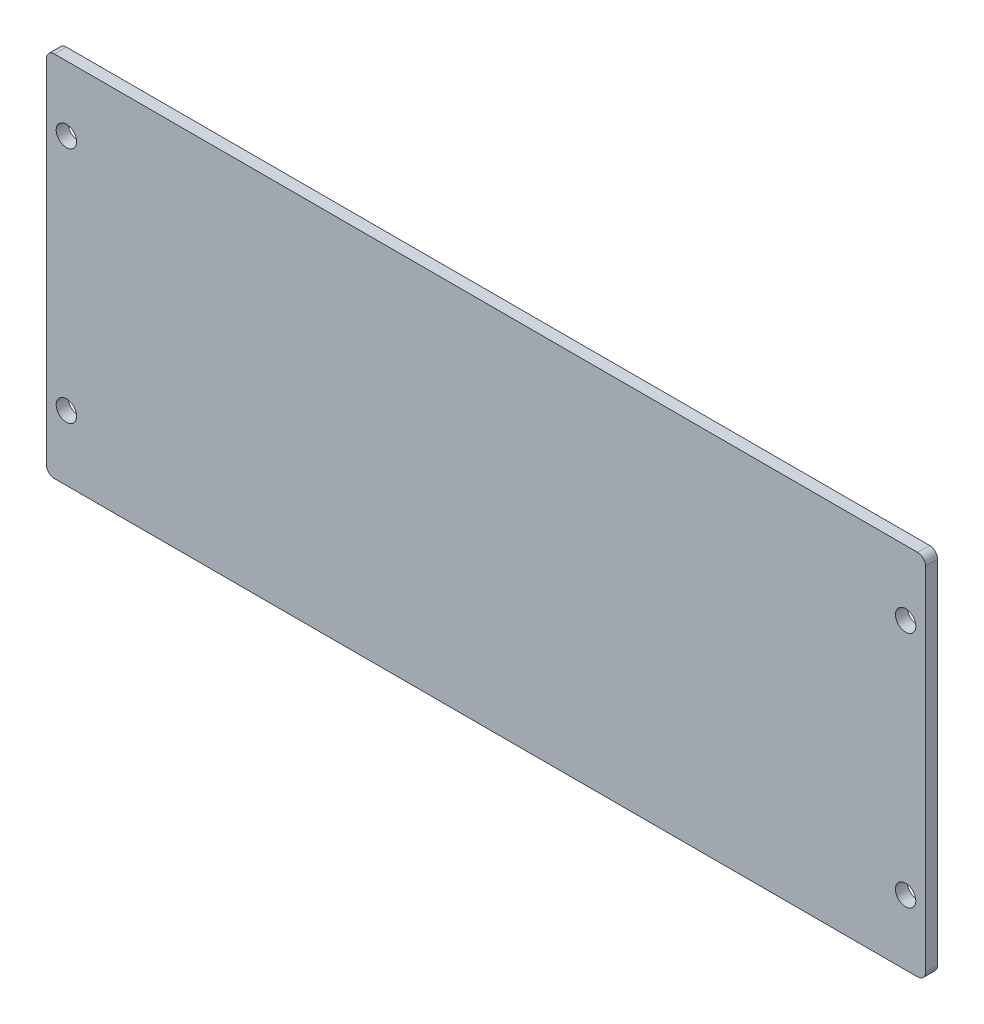
ISO-10303-21;
HEADER;
FILE_DESCRIPTION(('STEP AP214'),'2;1');
FILE_NAME('part.step','',(''),(''),'','','');
FILE_SCHEMA(('AUTOMOTIVE_DESIGN { 1 0 10303 214 1 1 1 1 }'));
ENDSEC;
DATA;
#1=APPLICATION_CONTEXT('core data for automotive mechanical design processes');
#2=APPLICATION_PROTOCOL_DEFINITION('international standard','automotive_design',2000,#1);
#3=PRODUCT_CONTEXT('',#1,'mechanical');
#4=PRODUCT('Part','Part','',(#3));
#5=PRODUCT_RELATED_PRODUCT_CATEGORY('part','',(#4));
#6=PRODUCT_DEFINITION_FORMATION('','',#4);
#7=PRODUCT_DEFINITION_CONTEXT('part definition',#1,'design');
#8=PRODUCT_DEFINITION('design','',#6,#7);
#9=PRODUCT_DEFINITION_SHAPE('','',#8);
#10=(LENGTH_UNIT() NAMED_UNIT(*) SI_UNIT(.MILLI.,.METRE.));
#11=(NAMED_UNIT(*) PLANE_ANGLE_UNIT() SI_UNIT($,.RADIAN.));
#12=(NAMED_UNIT(*) SI_UNIT($,.STERADIAN.) SOLID_ANGLE_UNIT());
#13=UNCERTAINTY_MEASURE_WITH_UNIT(LENGTH_MEASURE(1.E-05),#10,'distance_accuracy_value','');
#14=(GEOMETRIC_REPRESENTATION_CONTEXT(3) GLOBAL_UNCERTAINTY_ASSIGNED_CONTEXT((#13)) GLOBAL_UNIT_ASSIGNED_CONTEXT((#10,
#11,#12)) REPRESENTATION_CONTEXT('',''));
#15=CARTESIAN_POINT('',(0.,0.,0.));
#16=DIRECTION('',(0.,0.,1.));
#17=DIRECTION('',(1.,0.,0.));
#18=AXIS2_PLACEMENT_3D('',#15,#16,#17);
#19=CARTESIAN_POINT('',(0.,0.,3.));
#20=DIRECTION('',(0.,0.,1.));
#21=DIRECTION('',(1.,0.,0.));
#22=AXIS2_PLACEMENT_3D('',#19,#20,#21);
#23=PLANE('',#22);
#24=CARTESIAN_POINT('',(-105.,20.2453799555251,3.));
#25=DIRECTION('',(0.,0.,1.));
#26=DIRECTION('',(1.,0.,0.));
#27=AXIS2_PLACEMENT_3D('',#24,#25,#26);
#28=CIRCLE('',#27,2.54999999999999);
#29=CARTESIAN_POINT('',(-102.45,20.2453799555251,3.));
#30=VERTEX_POINT('',#29);
#31=EDGE_CURVE('E219',#30,#30,#28,.T.);
#32=ORIENTED_EDGE('',*,*,#31,.F.);
#33=EDGE_LOOP('',(#32));
#34=FACE_BOUND('',#33,.T.);
#35=CARTESIAN_POINT('',(105.,20.2453799555251,3.));
#36=DIRECTION('',(0.,0.,1.));
#37=DIRECTION('',(1.,0.,0.));
#38=AXIS2_PLACEMENT_3D('',#35,#36,#37);
#39=CIRCLE('',#38,2.54999999999999);
#40=CARTESIAN_POINT('',(107.55,20.2453799555251,3.));
#41=VERTEX_POINT('',#40);
#42=EDGE_CURVE('E197',#41,#41,#39,.T.);
#43=ORIENTED_EDGE('',*,*,#42,.F.);
#44=EDGE_LOOP('',(#43));
#45=FACE_BOUND('',#44,.T.);
#46=DIRECTION('',(0.,-1.,0.));
#47=VECTOR('',#46,1.);
#48=CARTESIAN_POINT('',(-110.,96.,3.));
#49=LINE('',#48,#47);
#50=CARTESIAN_POINT('',(-110.,94.,3.));
#51=VERTEX_POINT('',#50);
#52=CARTESIAN_POINT('',(-110.,6.00000000000001,3.));
#53=VERTEX_POINT('',#52);
#54=EDGE_CURVE('E202',#51,#53,#49,.T.);
#55=ORIENTED_EDGE('',*,*,#54,.T.);
#56=CARTESIAN_POINT('',(-108.,6.,3.));
#57=DIRECTION('',(0.,0.,1.));
#58=DIRECTION('',(1.,0.,0.));
#59=AXIS2_PLACEMENT_3D('',#56,#57,#58);
#60=CIRCLE('',#59,2.);
#61=CARTESIAN_POINT('',(-108.,4.,3.));
#62=VERTEX_POINT('',#61);
#63=EDGE_CURVE('E172',#53,#62,#60,.T.);
#64=ORIENTED_EDGE('',*,*,#63,.T.);
#65=DIRECTION('',(1.,0.,0.));
#66=VECTOR('',#65,1.);
#67=CARTESIAN_POINT('',(-110.,4.,3.));
#68=LINE('',#67,#66);
#69=CARTESIAN_POINT('',(108.,4.,3.));
#70=VERTEX_POINT('',#69);
#71=EDGE_CURVE('E130',#62,#70,#68,.T.);
#72=ORIENTED_EDGE('',*,*,#71,.T.);
#73=CARTESIAN_POINT('',(108.,6.,3.));
#74=DIRECTION('',(0.,0.,1.));
#75=DIRECTION('',(1.,0.,0.));
#76=AXIS2_PLACEMENT_3D('',#73,#74,#75);
#77=CIRCLE('',#76,2.);
#78=CARTESIAN_POINT('',(110.,6.,3.));
#79=VERTEX_POINT('',#78);
#80=EDGE_CURVE('E166',#70,#79,#77,.T.);
#81=ORIENTED_EDGE('',*,*,#80,.T.);
#82=DIRECTION('',(0.,1.,0.));
#83=VECTOR('',#82,1.);
#84=CARTESIAN_POINT('',(110.,4.,3.));
#85=LINE('',#84,#83);
#86=CARTESIAN_POINT('',(110.,94.,3.));
#87=VERTEX_POINT('',#86);
#88=EDGE_CURVE('E140',#79,#87,#85,.T.);
#89=ORIENTED_EDGE('',*,*,#88,.T.);
#90=CARTESIAN_POINT('',(108.,94.,3.));
#91=DIRECTION('',(0.,0.,1.));
#92=DIRECTION('',(1.,0.,0.));
#93=AXIS2_PLACEMENT_3D('',#90,#91,#92);
#94=CIRCLE('',#93,2.);
#95=CARTESIAN_POINT('',(108.,96.,3.));
#96=VERTEX_POINT('',#95);
#97=EDGE_CURVE('E64',#87,#96,#94,.T.);
#98=ORIENTED_EDGE('',*,*,#97,.T.);
#99=DIRECTION('',(-1.,0.,0.));
#100=VECTOR('',#99,1.);
#101=CARTESIAN_POINT('',(110.,96.,3.));
#102=LINE('',#101,#100);
#103=CARTESIAN_POINT('',(-108.,96.,3.));
#104=VERTEX_POINT('',#103);
#105=EDGE_CURVE('E145',#96,#104,#102,.T.);
#106=ORIENTED_EDGE('',*,*,#105,.T.);
#107=CARTESIAN_POINT('',(-108.,94.,3.));
#108=DIRECTION('',(0.,0.,1.));
#109=DIRECTION('',(1.,0.,0.));
#110=AXIS2_PLACEMENT_3D('',#107,#108,#109);
#111=CIRCLE('',#110,2.);
#112=EDGE_CURVE('E169',#104,#51,#111,.T.);
#113=ORIENTED_EDGE('',*,*,#112,.T.);
#114=EDGE_LOOP('',(#55,#64,#72,#81,#89,#98,#106,#113));
#115=FACE_BOUND('',#114,.T.);
#116=CARTESIAN_POINT('',(105.,79.7546200444749,3.));
#117=DIRECTION('',(0.,0.,1.));
#118=DIRECTION('',(1.,0.,0.));
#119=AXIS2_PLACEMENT_3D('',#116,#117,#118);
#120=CIRCLE('',#119,2.54999999999999);
#121=CARTESIAN_POINT('',(107.55,79.7546200444749,3.));
#122=VERTEX_POINT('',#121);
#123=EDGE_CURVE('E211',#122,#122,#120,.T.);
#124=ORIENTED_EDGE('',*,*,#123,.F.);
#125=EDGE_LOOP('',(#124));
#126=FACE_BOUND('',#125,.T.);
#127=CARTESIAN_POINT('',(-105.,79.7546200444749,3.));
#128=DIRECTION('',(0.,0.,1.));
#129=DIRECTION('',(1.,0.,0.));
#130=AXIS2_PLACEMENT_3D('',#127,#128,#129);
#131=CIRCLE('',#130,2.54999999999999);
#132=CARTESIAN_POINT('',(-102.45,79.7546200444749,3.));
#133=VERTEX_POINT('',#132);
#134=EDGE_CURVE('E227',#133,#133,#131,.T.);
#135=ORIENTED_EDGE('',*,*,#134,.F.);
#136=EDGE_LOOP('',(#135));
#137=FACE_BOUND('',#136,.T.);
#138=ADVANCED_FACE('F41',(#34,#45,#115,#126,#137),#23,.T.);
#139=CARTESIAN_POINT('',(0.,0.,0.));
#140=DIRECTION('',(0.,0.,1.));
#141=DIRECTION('',(1.,0.,0.));
#142=AXIS2_PLACEMENT_3D('',#139,#140,#141);
#143=PLANE('',#142);
#144=DIRECTION('',(1.,0.,0.));
#145=VECTOR('',#144,1.);
#146=CARTESIAN_POINT('',(-110.,4.,0.));
#147=LINE('',#146,#145);
#148=CARTESIAN_POINT('',(-108.,4.,0.));
#149=VERTEX_POINT('',#148);
#150=CARTESIAN_POINT('',(108.,4.,0.));
#151=VERTEX_POINT('',#150);
#152=EDGE_CURVE('E127',#149,#151,#147,.T.);
#153=ORIENTED_EDGE('',*,*,#152,.F.);
#154=CARTESIAN_POINT('',(-108.,6.,0.));
#155=DIRECTION('',(0.,0.,1.));
#156=DIRECTION('',(1.,0.,0.));
#157=AXIS2_PLACEMENT_3D('',#154,#155,#156);
#158=CIRCLE('',#157,2.);
#159=CARTESIAN_POINT('',(-110.,6.00000000000001,0.));
#160=VERTEX_POINT('',#159);
#161=EDGE_CURVE('E109',#149,#160,#158,.F.);
#162=ORIENTED_EDGE('',*,*,#161,.T.);
#163=DIRECTION('',(0.,-1.,0.));
#164=VECTOR('',#163,1.);
#165=CARTESIAN_POINT('',(-110.,96.,0.));
#166=LINE('',#165,#164);
#167=CARTESIAN_POINT('',(-110.,94.,0.));
#168=VERTEX_POINT('',#167);
#169=EDGE_CURVE('E141',#168,#160,#166,.T.);
#170=ORIENTED_EDGE('',*,*,#169,.F.);
#171=CARTESIAN_POINT('',(-108.,94.,0.));
#172=DIRECTION('',(0.,0.,1.));
#173=DIRECTION('',(1.,0.,0.));
#174=AXIS2_PLACEMENT_3D('',#171,#172,#173);
#175=CIRCLE('',#174,2.);
#176=CARTESIAN_POINT('',(-108.,96.,0.));
#177=VERTEX_POINT('',#176);
#178=EDGE_CURVE('E121',#168,#177,#175,.F.);
#179=ORIENTED_EDGE('',*,*,#178,.T.);
#180=DIRECTION('',(-1.,0.,0.));
#181=VECTOR('',#180,1.);
#182=CARTESIAN_POINT('',(-99.9999999999999,96.,0.));
#183=LINE('',#182,#181);
#184=CARTESIAN_POINT('',(108.,96.,0.));
#185=VERTEX_POINT('',#184);
#186=EDGE_CURVE('E147',#185,#177,#183,.T.);
#187=ORIENTED_EDGE('',*,*,#186,.F.);
#188=CARTESIAN_POINT('',(108.,94.,0.));
#189=DIRECTION('',(0.,0.,1.));
#190=DIRECTION('',(1.,0.,0.));
#191=AXIS2_PLACEMENT_3D('',#188,#189,#190);
#192=CIRCLE('',#191,2.);
#193=CARTESIAN_POINT('',(110.,94.,0.));
#194=VERTEX_POINT('',#193);
#195=EDGE_CURVE('E132',#185,#194,#192,.F.);
#196=ORIENTED_EDGE('',*,*,#195,.T.);
#197=DIRECTION('',(0.,1.,0.));
#198=VECTOR('',#197,1.);
#199=CARTESIAN_POINT('',(110.,4.,0.));
#200=LINE('',#199,#198);
#201=CARTESIAN_POINT('',(110.,6.,0.));
#202=VERTEX_POINT('',#201);
#203=EDGE_CURVE('E187',#202,#194,#200,.T.);
#204=ORIENTED_EDGE('',*,*,#203,.F.);
#205=CARTESIAN_POINT('',(108.,6.,0.));
#206=DIRECTION('',(0.,0.,1.));
#207=DIRECTION('',(1.,0.,0.));
#208=AXIS2_PLACEMENT_3D('',#205,#206,#207);
#209=CIRCLE('',#208,2.);
#210=EDGE_CURVE('E138',#202,#151,#209,.F.);
#211=ORIENTED_EDGE('',*,*,#210,.T.);
#212=EDGE_LOOP('',(#153,#162,#170,#179,#187,#196,#204,#211));
#213=FACE_BOUND('',#212,.T.);
#214=CARTESIAN_POINT('',(105.,20.2453799555251,0.));
#215=DIRECTION('',(0.,0.,1.));
#216=DIRECTION('',(1.,0.,0.));
#217=AXIS2_PLACEMENT_3D('',#214,#215,#216);
#218=CIRCLE('',#217,2.54999999999999);
#219=CARTESIAN_POINT('',(107.55,20.2453799555251,0.));
#220=VERTEX_POINT('',#219);
#221=EDGE_CURVE('E207',#220,#220,#218,.T.);
#222=ORIENTED_EDGE('',*,*,#221,.T.);
#223=EDGE_LOOP('',(#222));
#224=FACE_BOUND('',#223,.T.);
#225=CARTESIAN_POINT('',(105.,79.7546200444749,0.));
#226=DIRECTION('',(0.,0.,1.));
#227=DIRECTION('',(1.,0.,0.));
#228=AXIS2_PLACEMENT_3D('',#225,#226,#227);
#229=CIRCLE('',#228,2.54999999999999);
#230=CARTESIAN_POINT('',(107.55,79.7546200444749,0.));
#231=VERTEX_POINT('',#230);
#232=EDGE_CURVE('E215',#231,#231,#229,.T.);
#233=ORIENTED_EDGE('',*,*,#232,.T.);
#234=EDGE_LOOP('',(#233));
#235=FACE_BOUND('',#234,.T.);
#236=CARTESIAN_POINT('',(-105.,20.2453799555251,0.));
#237=DIRECTION('',(0.,0.,1.));
#238=DIRECTION('',(1.,0.,0.));
#239=AXIS2_PLACEMENT_3D('',#236,#237,#238);
#240=CIRCLE('',#239,2.54999999999999);
#241=CARTESIAN_POINT('',(-102.45,20.2453799555251,0.));
#242=VERTEX_POINT('',#241);
#243=EDGE_CURVE('E223',#242,#242,#240,.T.);
#244=ORIENTED_EDGE('',*,*,#243,.T.);
#245=EDGE_LOOP('',(#244));
#246=FACE_BOUND('',#245,.T.);
#247=CARTESIAN_POINT('',(-105.,79.7546200444749,0.));
#248=DIRECTION('',(0.,0.,1.));
#249=DIRECTION('',(1.,0.,0.));
#250=AXIS2_PLACEMENT_3D('',#247,#248,#249);
#251=CIRCLE('',#250,2.54999999999999);
#252=CARTESIAN_POINT('',(-102.45,79.7546200444749,0.));
#253=VERTEX_POINT('',#252);
#254=EDGE_CURVE('E231',#253,#253,#251,.T.);
#255=ORIENTED_EDGE('',*,*,#254,.T.);
#256=EDGE_LOOP('',(#255));
#257=FACE_BOUND('',#256,.T.);
#258=ADVANCED_FACE('F135',(#213,#224,#235,#246,#257),#143,.F.);
#259=CARTESIAN_POINT('',(110.,4.,3.));
#260=DIRECTION('',(-1.,0.,0.));
#261=DIRECTION('',(0.,-1.,0.));
#262=AXIS2_PLACEMENT_3D('',#259,#260,#261);
#263=PLANE('',#262);
#264=ORIENTED_EDGE('',*,*,#88,.F.);
#265=DIRECTION('',(0.,0.,-1.));
#266=VECTOR('',#265,1.);
#267=CARTESIAN_POINT('',(110.,6.,3.));
#268=LINE('',#267,#266);
#269=EDGE_CURVE('E11',#79,#202,#268,.T.);
#270=ORIENTED_EDGE('',*,*,#269,.T.);
#271=ORIENTED_EDGE('',*,*,#203,.T.);
#272=DIRECTION('',(0.,0.,-1.));
#273=VECTOR('',#272,1.);
#274=CARTESIAN_POINT('',(110.,94.,3.));
#275=LINE('',#274,#273);
#276=EDGE_CURVE('E50',#194,#87,#275,.F.);
#277=ORIENTED_EDGE('',*,*,#276,.T.);
#278=EDGE_LOOP('',(#264,#270,#271,#277));
#279=FACE_BOUND('',#278,.T.);
#280=ADVANCED_FACE('F185',(#279),#263,.F.);
#281=CARTESIAN_POINT('',(-99.9999999999999,96.,3.));
#282=DIRECTION('',(0.,-1.,0.));
#283=DIRECTION('',(0.,0.,-1.));
#284=AXIS2_PLACEMENT_3D('',#281,#282,#283);
#285=PLANE('',#284);
#286=ORIENTED_EDGE('',*,*,#186,.T.);
#287=DIRECTION('',(0.,0.,-1.));
#288=VECTOR('',#287,1.);
#289=CARTESIAN_POINT('',(-108.,96.,3.));
#290=LINE('',#289,#288);
#291=EDGE_CURVE('E57',#177,#104,#290,.F.);
#292=ORIENTED_EDGE('',*,*,#291,.T.);
#293=ORIENTED_EDGE('',*,*,#105,.F.);
#294=DIRECTION('',(0.,0.,-1.));
#295=VECTOR('',#294,1.);
#296=CARTESIAN_POINT('',(108.,96.,3.));
#297=LINE('',#296,#295);
#298=EDGE_CURVE('E175',#96,#185,#297,.T.);
#299=ORIENTED_EDGE('',*,*,#298,.T.);
#300=EDGE_LOOP('',(#286,#292,#293,#299));
#301=FACE_BOUND('',#300,.T.);
#302=ADVANCED_FACE('F194',(#301),#285,.F.);
#303=CARTESIAN_POINT('',(-110.,96.,3.));
#304=DIRECTION('',(1.,0.,0.));
#305=DIRECTION('',(0.,1.,0.));
#306=AXIS2_PLACEMENT_3D('',#303,#304,#305);
#307=PLANE('',#306);
#308=ORIENTED_EDGE('',*,*,#169,.T.);
#309=DIRECTION('',(0.,0.,-1.));
#310=VECTOR('',#309,1.);
#311=CARTESIAN_POINT('',(-110.,6.00000000000001,3.));
#312=LINE('',#311,#310);
#313=EDGE_CURVE('E114',#160,#53,#312,.F.);
#314=ORIENTED_EDGE('',*,*,#313,.T.);
#315=ORIENTED_EDGE('',*,*,#54,.F.);
#316=DIRECTION('',(0.,0.,-1.));
#317=VECTOR('',#316,1.);
#318=CARTESIAN_POINT('',(-110.,94.,3.));
#319=LINE('',#318,#317);
#320=EDGE_CURVE('E120',#51,#168,#319,.T.);
#321=ORIENTED_EDGE('',*,*,#320,.T.);
#322=EDGE_LOOP('',(#308,#314,#315,#321));
#323=FACE_BOUND('',#322,.T.);
#324=ADVANCED_FACE('F257',(#323),#307,.F.);
#325=CARTESIAN_POINT('',(-110.,4.,3.));
#326=DIRECTION('',(0.,1.,0.));
#327=DIRECTION('',(0.,0.,1.));
#328=AXIS2_PLACEMENT_3D('',#325,#326,#327);
#329=PLANE('',#328);
#330=ORIENTED_EDGE('',*,*,#71,.F.);
#331=DIRECTION('',(0.,0.,-1.));
#332=VECTOR('',#331,1.);
#333=CARTESIAN_POINT('',(-108.,4.,3.));
#334=LINE('',#333,#332);
#335=EDGE_CURVE('E113',#62,#149,#334,.T.);
#336=ORIENTED_EDGE('',*,*,#335,.T.);
#337=ORIENTED_EDGE('',*,*,#152,.T.);
#338=DIRECTION('',(0.,0.,-1.));
#339=VECTOR('',#338,1.);
#340=CARTESIAN_POINT('',(108.,4.,3.));
#341=LINE('',#340,#339);
#342=EDGE_CURVE('E133',#151,#70,#341,.F.);
#343=ORIENTED_EDGE('',*,*,#342,.T.);
#344=EDGE_LOOP('',(#330,#336,#337,#343));
#345=FACE_BOUND('',#344,.T.);
#346=ADVANCED_FACE('F126',(#345),#329,.F.);
#347=CARTESIAN_POINT('',(105.,20.2453799555251,3.));
#348=DIRECTION('',(0.,0.,-1.));
#349=DIRECTION('',(-1.,0.,0.));
#350=AXIS2_PLACEMENT_3D('',#347,#348,#349);
#351=CYLINDRICAL_SURFACE('',#350,2.54999999999999);
#352=ORIENTED_EDGE('',*,*,#42,.T.);
#353=EDGE_LOOP('',(#352));
#354=FACE_BOUND('',#353,.T.);
#355=ORIENTED_EDGE('',*,*,#221,.F.);
#356=EDGE_LOOP('',(#355));
#357=FACE_BOUND('',#356,.T.);
#358=ADVANCED_FACE('F252',(#354,#357),#351,.F.);
#359=CARTESIAN_POINT('',(105.,79.7546200444749,3.));
#360=DIRECTION('',(0.,0.,-1.));
#361=DIRECTION('',(-1.,0.,0.));
#362=AXIS2_PLACEMENT_3D('',#359,#360,#361);
#363=CYLINDRICAL_SURFACE('',#362,2.54999999999999);
#364=ORIENTED_EDGE('',*,*,#123,.T.);
#365=EDGE_LOOP('',(#364));
#366=FACE_BOUND('',#365,.T.);
#367=ORIENTED_EDGE('',*,*,#232,.F.);
#368=EDGE_LOOP('',(#367));
#369=FACE_BOUND('',#368,.T.);
#370=ADVANCED_FACE('F353',(#366,#369),#363,.F.);
#371=CARTESIAN_POINT('',(-105.,20.2453799555251,3.));
#372=DIRECTION('',(0.,0.,-1.));
#373=DIRECTION('',(-1.,0.,0.));
#374=AXIS2_PLACEMENT_3D('',#371,#372,#373);
#375=CYLINDRICAL_SURFACE('',#374,2.54999999999999);
#376=ORIENTED_EDGE('',*,*,#31,.T.);
#377=EDGE_LOOP('',(#376));
#378=FACE_BOUND('',#377,.T.);
#379=ORIENTED_EDGE('',*,*,#243,.F.);
#380=EDGE_LOOP('',(#379));
#381=FACE_BOUND('',#380,.T.);
#382=ADVANCED_FACE('F344',(#378,#381),#375,.F.);
#383=CARTESIAN_POINT('',(-105.,79.7546200444749,3.));
#384=DIRECTION('',(0.,0.,-1.));
#385=DIRECTION('',(-1.,0.,0.));
#386=AXIS2_PLACEMENT_3D('',#383,#384,#385);
#387=CYLINDRICAL_SURFACE('',#386,2.54999999999999);
#388=ORIENTED_EDGE('',*,*,#134,.T.);
#389=EDGE_LOOP('',(#388));
#390=FACE_BOUND('',#389,.T.);
#391=ORIENTED_EDGE('',*,*,#254,.F.);
#392=EDGE_LOOP('',(#391));
#393=FACE_BOUND('',#392,.T.);
#394=ADVANCED_FACE('F239',(#390,#393),#387,.F.);
#395=CARTESIAN_POINT('',(-108.,6.,3.));
#396=DIRECTION('',(0.,0.,-1.));
#397=DIRECTION('',(-1.,0.,0.));
#398=AXIS2_PLACEMENT_3D('',#395,#396,#397);
#399=CYLINDRICAL_SURFACE('',#398,2.);
#400=ORIENTED_EDGE('',*,*,#63,.F.);
#401=ORIENTED_EDGE('',*,*,#313,.F.);
#402=ORIENTED_EDGE('',*,*,#161,.F.);
#403=ORIENTED_EDGE('',*,*,#335,.F.);
#404=EDGE_LOOP('',(#400,#401,#402,#403));
#405=FACE_BOUND('',#404,.T.);
#406=ADVANCED_FACE('F112',(#405),#399,.T.);
#407=CARTESIAN_POINT('',(-108.,94.,3.));
#408=DIRECTION('',(0.,0.,-1.));
#409=DIRECTION('',(-1.,0.,0.));
#410=AXIS2_PLACEMENT_3D('',#407,#408,#409);
#411=CYLINDRICAL_SURFACE('',#410,2.);
#412=ORIENTED_EDGE('',*,*,#112,.F.);
#413=ORIENTED_EDGE('',*,*,#291,.F.);
#414=ORIENTED_EDGE('',*,*,#178,.F.);
#415=ORIENTED_EDGE('',*,*,#320,.F.);
#416=EDGE_LOOP('',(#412,#413,#414,#415));
#417=FACE_BOUND('',#416,.T.);
#418=ADVANCED_FACE('F267',(#417),#411,.T.);
#419=CARTESIAN_POINT('',(108.,6.,3.));
#420=DIRECTION('',(0.,0.,-1.));
#421=DIRECTION('',(-1.,0.,0.));
#422=AXIS2_PLACEMENT_3D('',#419,#420,#421);
#423=CYLINDRICAL_SURFACE('',#422,2.);
#424=ORIENTED_EDGE('',*,*,#80,.F.);
#425=ORIENTED_EDGE('',*,*,#342,.F.);
#426=ORIENTED_EDGE('',*,*,#210,.F.);
#427=ORIENTED_EDGE('',*,*,#269,.F.);
#428=EDGE_LOOP('',(#424,#425,#426,#427));
#429=FACE_BOUND('',#428,.T.);
#430=ADVANCED_FACE('F269',(#429),#423,.T.);
#431=CARTESIAN_POINT('',(108.,94.,3.));
#432=DIRECTION('',(0.,0.,-1.));
#433=DIRECTION('',(-1.,0.,0.));
#434=AXIS2_PLACEMENT_3D('',#431,#432,#433);
#435=CYLINDRICAL_SURFACE('',#434,2.);
#436=ORIENTED_EDGE('',*,*,#97,.F.);
#437=ORIENTED_EDGE('',*,*,#276,.F.);
#438=ORIENTED_EDGE('',*,*,#195,.F.);
#439=ORIENTED_EDGE('',*,*,#298,.F.);
#440=EDGE_LOOP('',(#436,#437,#438,#439));
#441=FACE_BOUND('',#440,.T.);
#442=ADVANCED_FACE('F43',(#441),#435,.T.);
#443=CLOSED_SHELL('',(#138,#258,#280,#302,#324,#346,#358,#370,#382,#394,#406,#418,#430,#442));
#444=MANIFOLD_SOLID_BREP('B2',#443);
#445=ADVANCED_BREP_SHAPE_REPRESENTATION('',(#18,#444),#14);
#446=SHAPE_DEFINITION_REPRESENTATION(#9,#445);
ENDSEC;
END-ISO-10303-21;
